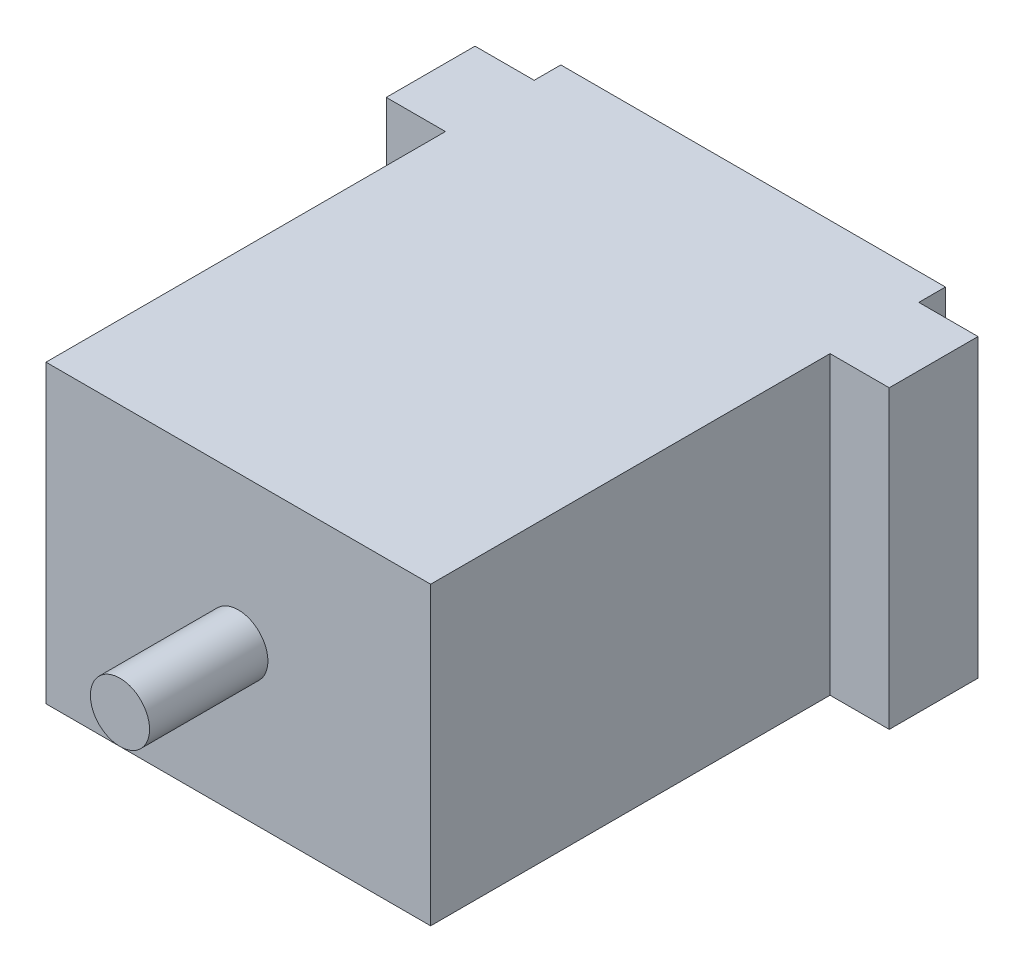
ISO-10303-21;
HEADER;
FILE_DESCRIPTION(('STEP AP214'),'2;1');
FILE_NAME('part.step','',(''),(''),'','','');
FILE_SCHEMA(('AUTOMOTIVE_DESIGN { 1 0 10303 214 1 1 1 1 }'));
ENDSEC;
DATA;
#1=APPLICATION_CONTEXT('core data for automotive mechanical design processes');
#2=APPLICATION_PROTOCOL_DEFINITION('international standard','automotive_design',2000,#1);
#3=PRODUCT_CONTEXT('',#1,'mechanical');
#4=PRODUCT('Part','Part','',(#3));
#5=PRODUCT_RELATED_PRODUCT_CATEGORY('part','',(#4));
#6=PRODUCT_DEFINITION_FORMATION('','',#4);
#7=PRODUCT_DEFINITION_CONTEXT('part definition',#1,'design');
#8=PRODUCT_DEFINITION('design','',#6,#7);
#9=PRODUCT_DEFINITION_SHAPE('','',#8);
#10=(LENGTH_UNIT() NAMED_UNIT(*) SI_UNIT(.MILLI.,.METRE.));
#11=(NAMED_UNIT(*) PLANE_ANGLE_UNIT() SI_UNIT($,.RADIAN.));
#12=(NAMED_UNIT(*) SI_UNIT($,.STERADIAN.) SOLID_ANGLE_UNIT());
#13=UNCERTAINTY_MEASURE_WITH_UNIT(LENGTH_MEASURE(1.E-05),#10,'distance_accuracy_value','');
#14=(GEOMETRIC_REPRESENTATION_CONTEXT(3) GLOBAL_UNCERTAINTY_ASSIGNED_CONTEXT((#13)) GLOBAL_UNIT_ASSIGNED_CONTEXT((#10,
#11,#12)) REPRESENTATION_CONTEXT('',''));
#15=CARTESIAN_POINT('',(0.,0.,0.));
#16=DIRECTION('',(0.,0.,1.));
#17=DIRECTION('',(1.,0.,0.));
#18=AXIS2_PLACEMENT_3D('',#15,#16,#17);
#19=CARTESIAN_POINT('',(-32.5,25.,150.));
#20=DIRECTION('',(1.,0.,0.));
#21=DIRECTION('',(0.,0.,-1.));
#22=AXIS2_PLACEMENT_3D('',#19,#20,#21);
#23=PLANE('',#22);
#24=DIRECTION('',(0.,0.,-1.));
#25=VECTOR('',#24,1.);
#26=CARTESIAN_POINT('',(-32.5,25.,150.));
#27=LINE('',#26,#25);
#28=CARTESIAN_POINT('',(-32.5,25.,67.5));
#29=VERTEX_POINT('',#28);
#30=CARTESIAN_POINT('',(-32.5,25.,63.));
#31=VERTEX_POINT('',#30);
#32=EDGE_CURVE('E145',#29,#31,#27,.T.);
#33=ORIENTED_EDGE('',*,*,#32,.T.);
#34=DIRECTION('',(0.,1.,0.));
#35=VECTOR('',#34,1.);
#36=CARTESIAN_POINT('',(-32.5,-25.,63.));
#37=LINE('',#36,#35);
#38=CARTESIAN_POINT('',(-32.5,-25.,63.));
#39=VERTEX_POINT('',#38);
#40=EDGE_CURVE('E130',#39,#31,#37,.T.);
#41=ORIENTED_EDGE('',*,*,#40,.F.);
#42=DIRECTION('',(0.,0.,-1.));
#43=VECTOR('',#42,1.);
#44=CARTESIAN_POINT('',(-32.5,-25.,150.));
#45=LINE('',#44,#43);
#46=CARTESIAN_POINT('',(-32.5,-25.,67.5));
#47=VERTEX_POINT('',#46);
#48=EDGE_CURVE('E143',#47,#39,#45,.T.);
#49=ORIENTED_EDGE('',*,*,#48,.F.);
#50=DIRECTION('',(0.,1.,0.));
#51=VECTOR('',#50,1.);
#52=CARTESIAN_POINT('',(-32.5,25.,67.5));
#53=LINE('',#52,#51);
#54=EDGE_CURVE('E190',#47,#29,#53,.T.);
#55=ORIENTED_EDGE('',*,*,#54,.T.);
#56=EDGE_LOOP('',(#33,#41,#49,#55));
#57=FACE_BOUND('',#56,.T.);
#58=ADVANCED_FACE('F39',(#57),#23,.F.);
#59=CARTESIAN_POINT('',(32.5,25.,150.));
#60=DIRECTION('',(-1.,0.,0.));
#61=DIRECTION('',(0.,-1.,0.));
#62=AXIS2_PLACEMENT_3D('',#59,#60,#61);
#63=PLANE('',#62);
#64=DIRECTION('',(0.,0.,-1.));
#65=VECTOR('',#64,1.);
#66=CARTESIAN_POINT('',(32.5,-25.,150.));
#67=LINE('',#66,#65);
#68=CARTESIAN_POINT('',(32.5,-25.,67.5));
#69=VERTEX_POINT('',#68);
#70=CARTESIAN_POINT('',(32.5,-25.,63.));
#71=VERTEX_POINT('',#70);
#72=EDGE_CURVE('E159',#69,#71,#67,.T.);
#73=ORIENTED_EDGE('',*,*,#72,.T.);
#74=DIRECTION('',(0.,1.,0.));
#75=VECTOR('',#74,1.);
#76=CARTESIAN_POINT('',(32.5,-25.,63.));
#77=LINE('',#76,#75);
#78=CARTESIAN_POINT('',(32.5,25.,63.));
#79=VERTEX_POINT('',#78);
#80=EDGE_CURVE('E55',#71,#79,#77,.T.);
#81=ORIENTED_EDGE('',*,*,#80,.T.);
#82=DIRECTION('',(0.,0.,-1.));
#83=VECTOR('',#82,1.);
#84=CARTESIAN_POINT('',(32.5,25.,150.));
#85=LINE('',#84,#83);
#86=CARTESIAN_POINT('',(32.5,25.,67.5));
#87=VERTEX_POINT('',#86);
#88=EDGE_CURVE('E48',#87,#79,#85,.T.);
#89=ORIENTED_EDGE('',*,*,#88,.F.);
#90=DIRECTION('',(0.,1.,0.));
#91=VECTOR('',#90,1.);
#92=CARTESIAN_POINT('',(32.5,25.,67.5));
#93=LINE('',#92,#91);
#94=EDGE_CURVE('E178',#69,#87,#93,.T.);
#95=ORIENTED_EDGE('',*,*,#94,.F.);
#96=EDGE_LOOP('',(#73,#81,#89,#95));
#97=FACE_BOUND('',#96,.T.);
#98=ADVANCED_FACE('F41',(#97),#63,.F.);
#99=DIRECTION('',(0.,-1.,0.));
#100=VECTOR('',#99,1.);
#101=CARTESIAN_POINT('',(32.5,25.,82.5));
#102=LINE('',#101,#100);
#103=CARTESIAN_POINT('',(32.5,25.,82.5));
#104=VERTEX_POINT('',#103);
#105=CARTESIAN_POINT('',(32.5,-25.,82.5));
#106=VERTEX_POINT('',#105);
#107=EDGE_CURVE('E226',#104,#106,#102,.T.);
#108=ORIENTED_EDGE('',*,*,#107,.F.);
#109=CARTESIAN_POINT('',(32.5,25.,150.));
#110=VERTEX_POINT('',#109);
#111=EDGE_CURVE('E11',#110,#104,#85,.T.);
#112=ORIENTED_EDGE('',*,*,#111,.F.);
#113=DIRECTION('',(0.,1.,0.));
#114=VECTOR('',#113,1.);
#115=CARTESIAN_POINT('',(32.5,25.,150.));
#116=LINE('',#115,#114);
#117=CARTESIAN_POINT('',(32.5,-25.,150.));
#118=VERTEX_POINT('',#117);
#119=EDGE_CURVE('E254',#118,#110,#116,.T.);
#120=ORIENTED_EDGE('',*,*,#119,.F.);
#121=EDGE_CURVE('E154',#118,#106,#67,.T.);
#122=ORIENTED_EDGE('',*,*,#121,.T.);
#123=EDGE_LOOP('',(#108,#112,#120,#122));
#124=FACE_BOUND('',#123,.T.);
#125=ADVANCED_FACE('F276',(#124),#63,.F.);
#126=CARTESIAN_POINT('',(-32.5,25.,150.));
#127=DIRECTION('',(0.,-1.,0.));
#128=DIRECTION('',(0.,0.,-1.));
#129=AXIS2_PLACEMENT_3D('',#126,#127,#128);
#130=PLANE('',#129);
#131=ORIENTED_EDGE('',*,*,#88,.T.);
#132=DIRECTION('',(1.,0.,0.));
#133=VECTOR('',#132,1.);
#134=CARTESIAN_POINT('',(-32.5,25.,63.));
#135=LINE('',#134,#133);
#136=EDGE_CURVE('E137',#31,#79,#135,.T.);
#137=ORIENTED_EDGE('',*,*,#136,.F.);
#138=ORIENTED_EDGE('',*,*,#32,.F.);
#139=DIRECTION('',(1.,0.,0.));
#140=VECTOR('',#139,1.);
#141=CARTESIAN_POINT('',(-42.5,25.,67.5));
#142=LINE('',#141,#140);
#143=CARTESIAN_POINT('',(-42.5,25.,67.5));
#144=VERTEX_POINT('',#143);
#145=EDGE_CURVE('E207',#144,#29,#142,.T.);
#146=ORIENTED_EDGE('',*,*,#145,.F.);
#147=DIRECTION('',(0.,0.,1.));
#148=VECTOR('',#147,1.);
#149=CARTESIAN_POINT('',(-42.5,25.,82.5));
#150=LINE('',#149,#148);
#151=CARTESIAN_POINT('',(-42.5,25.,82.5));
#152=VERTEX_POINT('',#151);
#153=EDGE_CURVE('E203',#144,#152,#150,.T.);
#154=ORIENTED_EDGE('',*,*,#153,.T.);
#155=DIRECTION('',(1.,0.,0.));
#156=VECTOR('',#155,1.);
#157=CARTESIAN_POINT('',(-42.5,25.,82.5));
#158=LINE('',#157,#156);
#159=CARTESIAN_POINT('',(-32.5,25.,82.5));
#160=VERTEX_POINT('',#159);
#161=EDGE_CURVE('E214',#152,#160,#158,.T.);
#162=ORIENTED_EDGE('',*,*,#161,.T.);
#163=CARTESIAN_POINT('',(-32.5,25.,150.));
#164=VERTEX_POINT('',#163);
#165=EDGE_CURVE('E162',#164,#160,#27,.T.);
#166=ORIENTED_EDGE('',*,*,#165,.F.);
#167=DIRECTION('',(-1.,0.,0.));
#168=VECTOR('',#167,1.);
#169=CARTESIAN_POINT('',(-32.5,25.,150.));
#170=LINE('',#169,#168);
#171=EDGE_CURVE('E258',#110,#164,#170,.T.);
#172=ORIENTED_EDGE('',*,*,#171,.F.);
#173=ORIENTED_EDGE('',*,*,#111,.T.);
#174=DIRECTION('',(-1.,0.,0.));
#175=VECTOR('',#174,1.);
#176=CARTESIAN_POINT('',(42.5,25.,82.5));
#177=LINE('',#176,#175);
#178=CARTESIAN_POINT('',(42.5,25.,82.5));
#179=VERTEX_POINT('',#178);
#180=EDGE_CURVE('E248',#179,#104,#177,.T.);
#181=ORIENTED_EDGE('',*,*,#180,.F.);
#182=DIRECTION('',(0.,0.,1.));
#183=VECTOR('',#182,1.);
#184=CARTESIAN_POINT('',(42.5,25.,82.5));
#185=LINE('',#184,#183);
#186=CARTESIAN_POINT('',(42.5,25.,67.5));
#187=VERTEX_POINT('',#186);
#188=EDGE_CURVE('E225',#187,#179,#185,.T.);
#189=ORIENTED_EDGE('',*,*,#188,.F.);
#190=DIRECTION('',(-1.,0.,0.));
#191=VECTOR('',#190,1.);
#192=CARTESIAN_POINT('',(42.5,25.,67.5));
#193=LINE('',#192,#191);
#194=EDGE_CURVE('E175',#187,#87,#193,.T.);
#195=ORIENTED_EDGE('',*,*,#194,.T.);
#196=EDGE_LOOP('',(#131,#137,#138,#146,#154,#162,#166,#172,#173,#181,#189,#195));
#197=FACE_BOUND('',#196,.T.);
#198=ADVANCED_FACE('F173',(#197),#130,.F.);
#199=ORIENTED_EDGE('',*,*,#165,.T.);
#200=DIRECTION('',(0.,-1.,0.));
#201=VECTOR('',#200,1.);
#202=CARTESIAN_POINT('',(-32.5,25.,82.5));
#203=LINE('',#202,#201);
#204=CARTESIAN_POINT('',(-32.5,-25.,82.5));
#205=VERTEX_POINT('',#204);
#206=EDGE_CURVE('E197',#160,#205,#203,.T.);
#207=ORIENTED_EDGE('',*,*,#206,.T.);
#208=CARTESIAN_POINT('',(-32.5,-25.,150.));
#209=VERTEX_POINT('',#208);
#210=EDGE_CURVE('E153',#209,#205,#45,.T.);
#211=ORIENTED_EDGE('',*,*,#210,.F.);
#212=DIRECTION('',(0.,-1.,0.));
#213=VECTOR('',#212,1.);
#214=CARTESIAN_POINT('',(-32.5,25.,150.));
#215=LINE('',#214,#213);
#216=EDGE_CURVE('E261',#164,#209,#215,.T.);
#217=ORIENTED_EDGE('',*,*,#216,.F.);
#218=EDGE_LOOP('',(#199,#207,#211,#217));
#219=FACE_BOUND('',#218,.T.);
#220=ADVANCED_FACE('F298',(#219),#23,.F.);
#221=CARTESIAN_POINT('',(-32.5,-25.,150.));
#222=DIRECTION('',(0.,1.,0.));
#223=DIRECTION('',(0.,0.,1.));
#224=AXIS2_PLACEMENT_3D('',#221,#222,#223);
#225=PLANE('',#224);
#226=ORIENTED_EDGE('',*,*,#48,.T.);
#227=DIRECTION('',(1.,0.,0.));
#228=VECTOR('',#227,1.);
#229=CARTESIAN_POINT('',(-32.5,-25.,63.));
#230=LINE('',#229,#228);
#231=EDGE_CURVE('E127',#39,#71,#230,.T.);
#232=ORIENTED_EDGE('',*,*,#231,.T.);
#233=ORIENTED_EDGE('',*,*,#72,.F.);
#234=DIRECTION('',(-1.,0.,0.));
#235=VECTOR('',#234,1.);
#236=CARTESIAN_POINT('',(42.5,-25.,67.5));
#237=LINE('',#236,#235);
#238=CARTESIAN_POINT('',(42.5,-25.,67.5));
#239=VERTEX_POINT('',#238);
#240=EDGE_CURVE('E235',#239,#69,#237,.T.);
#241=ORIENTED_EDGE('',*,*,#240,.F.);
#242=DIRECTION('',(0.,0.,-1.));
#243=VECTOR('',#242,1.);
#244=CARTESIAN_POINT('',(42.5,-25.,82.5));
#245=LINE('',#244,#243);
#246=CARTESIAN_POINT('',(42.5,-25.,82.5));
#247=VERTEX_POINT('',#246);
#248=EDGE_CURVE('E232',#247,#239,#245,.T.);
#249=ORIENTED_EDGE('',*,*,#248,.F.);
#250=DIRECTION('',(-1.,0.,0.));
#251=VECTOR('',#250,1.);
#252=CARTESIAN_POINT('',(42.5,-25.,82.5));
#253=LINE('',#252,#251);
#254=EDGE_CURVE('E244',#247,#106,#253,.T.);
#255=ORIENTED_EDGE('',*,*,#254,.T.);
#256=ORIENTED_EDGE('',*,*,#121,.F.);
#257=DIRECTION('',(1.,0.,0.));
#258=VECTOR('',#257,1.);
#259=CARTESIAN_POINT('',(-32.5,-25.,150.));
#260=LINE('',#259,#258);
#261=EDGE_CURVE('E263',#209,#118,#260,.T.);
#262=ORIENTED_EDGE('',*,*,#261,.F.);
#263=ORIENTED_EDGE('',*,*,#210,.T.);
#264=DIRECTION('',(1.,0.,0.));
#265=VECTOR('',#264,1.);
#266=CARTESIAN_POINT('',(-42.5,-25.,82.5));
#267=LINE('',#266,#265);
#268=CARTESIAN_POINT('',(-42.5,-25.,82.5));
#269=VERTEX_POINT('',#268);
#270=EDGE_CURVE('E63',#269,#205,#267,.T.);
#271=ORIENTED_EDGE('',*,*,#270,.F.);
#272=DIRECTION('',(0.,0.,-1.));
#273=VECTOR('',#272,1.);
#274=CARTESIAN_POINT('',(-42.5,-25.,82.5));
#275=LINE('',#274,#273);
#276=CARTESIAN_POINT('',(-42.5,-25.,67.5));
#277=VERTEX_POINT('',#276);
#278=EDGE_CURVE('E196',#269,#277,#275,.T.);
#279=ORIENTED_EDGE('',*,*,#278,.T.);
#280=DIRECTION('',(1.,0.,0.));
#281=VECTOR('',#280,1.);
#282=CARTESIAN_POINT('',(-42.5,-25.,67.5));
#283=LINE('',#282,#281);
#284=EDGE_CURVE('E150',#277,#47,#283,.T.);
#285=ORIENTED_EDGE('',*,*,#284,.T.);
#286=EDGE_LOOP('',(#226,#232,#233,#241,#249,#255,#256,#262,#263,#271,#279,#285));
#287=FACE_BOUND('',#286,.T.);
#288=ADVANCED_FACE('F148',(#287),#225,.F.);
#289=CARTESIAN_POINT('',(0.,0.,150.));
#290=DIRECTION('',(0.,0.,1.));
#291=DIRECTION('',(1.,0.,0.));
#292=AXIS2_PLACEMENT_3D('',#289,#290,#291);
#293=PLANE('',#292);
#294=CARTESIAN_POINT('',(0.,0.,150.));
#295=DIRECTION('',(0.,0.,1.));
#296=DIRECTION('',(1.,0.,0.));
#297=AXIS2_PLACEMENT_3D('',#294,#295,#296);
#298=CIRCLE('',#297,5.);
#299=CARTESIAN_POINT('',(5.,0.,150.));
#300=VERTEX_POINT('',#299);
#301=EDGE_CURVE('E180',#300,#300,#298,.T.);
#302=ORIENTED_EDGE('',*,*,#301,.F.);
#303=EDGE_LOOP('',(#302));
#304=FACE_BOUND('',#303,.T.);
#305=ORIENTED_EDGE('',*,*,#119,.T.);
#306=ORIENTED_EDGE('',*,*,#171,.T.);
#307=ORIENTED_EDGE('',*,*,#216,.T.);
#308=ORIENTED_EDGE('',*,*,#261,.T.);
#309=EDGE_LOOP('',(#305,#306,#307,#308));
#310=FACE_BOUND('',#309,.T.);
#311=ADVANCED_FACE('F269',(#304,#310),#293,.T.);
#312=CARTESIAN_POINT('',(42.5,25.,67.5));
#313=DIRECTION('',(0.,0.,1.));
#314=DIRECTION('',(0.,-1.,0.));
#315=AXIS2_PLACEMENT_3D('',#312,#313,#314);
#316=PLANE('',#315);
#317=ORIENTED_EDGE('',*,*,#94,.T.);
#318=ORIENTED_EDGE('',*,*,#194,.F.);
#319=DIRECTION('',(0.,1.,0.));
#320=VECTOR('',#319,1.);
#321=CARTESIAN_POINT('',(42.5,25.,67.5));
#322=LINE('',#321,#320);
#323=EDGE_CURVE('E221',#239,#187,#322,.T.);
#324=ORIENTED_EDGE('',*,*,#323,.F.);
#325=ORIENTED_EDGE('',*,*,#240,.T.);
#326=EDGE_LOOP('',(#317,#318,#324,#325));
#327=FACE_BOUND('',#326,.T.);
#328=ADVANCED_FACE('F286',(#327),#316,.F.);
#329=CARTESIAN_POINT('',(42.5,25.,82.5));
#330=DIRECTION('',(0.,0.,-1.));
#331=DIRECTION('',(0.,1.,0.));
#332=AXIS2_PLACEMENT_3D('',#329,#330,#331);
#333=PLANE('',#332);
#334=ORIENTED_EDGE('',*,*,#107,.T.);
#335=ORIENTED_EDGE('',*,*,#254,.F.);
#336=DIRECTION('',(0.,-1.,0.));
#337=VECTOR('',#336,1.);
#338=CARTESIAN_POINT('',(42.5,25.,82.5));
#339=LINE('',#338,#337);
#340=EDGE_CURVE('E229',#179,#247,#339,.T.);
#341=ORIENTED_EDGE('',*,*,#340,.F.);
#342=ORIENTED_EDGE('',*,*,#180,.T.);
#343=EDGE_LOOP('',(#334,#335,#341,#342));
#344=FACE_BOUND('',#343,.T.);
#345=ADVANCED_FACE('F280',(#344),#333,.F.);
#346=CARTESIAN_POINT('',(42.5,0.,0.));
#347=DIRECTION('',(1.,0.,0.));
#348=DIRECTION('',(0.,0.,-1.));
#349=AXIS2_PLACEMENT_3D('',#346,#347,#348);
#350=PLANE('',#349);
#351=ORIENTED_EDGE('',*,*,#323,.T.);
#352=ORIENTED_EDGE('',*,*,#188,.T.);
#353=ORIENTED_EDGE('',*,*,#340,.T.);
#354=ORIENTED_EDGE('',*,*,#248,.T.);
#355=EDGE_LOOP('',(#351,#352,#353,#354));
#356=FACE_BOUND('',#355,.T.);
#357=ADVANCED_FACE('F282',(#356),#350,.T.);
#358=CARTESIAN_POINT('',(-42.5,25.,67.5));
#359=DIRECTION('',(0.,0.,-1.));
#360=DIRECTION('',(0.,1.,0.));
#361=AXIS2_PLACEMENT_3D('',#358,#359,#360);
#362=PLANE('',#361);
#363=ORIENTED_EDGE('',*,*,#54,.F.);
#364=ORIENTED_EDGE('',*,*,#284,.F.);
#365=DIRECTION('',(0.,1.,0.));
#366=VECTOR('',#365,1.);
#367=CARTESIAN_POINT('',(-42.5,25.,67.5));
#368=LINE('',#367,#366);
#369=EDGE_CURVE('E192',#277,#144,#368,.T.);
#370=ORIENTED_EDGE('',*,*,#369,.T.);
#371=ORIENTED_EDGE('',*,*,#145,.T.);
#372=EDGE_LOOP('',(#363,#364,#370,#371));
#373=FACE_BOUND('',#372,.T.);
#374=ADVANCED_FACE('F374',(#373),#362,.T.);
#375=CARTESIAN_POINT('',(-42.5,25.,82.5));
#376=DIRECTION('',(0.,0.,1.));
#377=DIRECTION('',(0.,-1.,0.));
#378=AXIS2_PLACEMENT_3D('',#375,#376,#377);
#379=PLANE('',#378);
#380=ORIENTED_EDGE('',*,*,#206,.F.);
#381=ORIENTED_EDGE('',*,*,#161,.F.);
#382=DIRECTION('',(0.,-1.,0.));
#383=VECTOR('',#382,1.);
#384=CARTESIAN_POINT('',(-42.5,25.,82.5));
#385=LINE('',#384,#383);
#386=EDGE_CURVE('E200',#152,#269,#385,.T.);
#387=ORIENTED_EDGE('',*,*,#386,.T.);
#388=ORIENTED_EDGE('',*,*,#270,.T.);
#389=EDGE_LOOP('',(#380,#381,#387,#388));
#390=FACE_BOUND('',#389,.T.);
#391=ADVANCED_FACE('F366',(#390),#379,.T.);
#392=CARTESIAN_POINT('',(-42.5,0.,0.));
#393=DIRECTION('',(-1.,0.,0.));
#394=DIRECTION('',(0.,0.,-1.));
#395=AXIS2_PLACEMENT_3D('',#392,#393,#394);
#396=PLANE('',#395);
#397=ORIENTED_EDGE('',*,*,#369,.F.);
#398=ORIENTED_EDGE('',*,*,#278,.F.);
#399=ORIENTED_EDGE('',*,*,#386,.F.);
#400=ORIENTED_EDGE('',*,*,#153,.F.);
#401=EDGE_LOOP('',(#397,#398,#399,#400));
#402=FACE_BOUND('',#401,.T.);
#403=ADVANCED_FACE('F357',(#402),#396,.T.);
#404=CARTESIAN_POINT('',(0.,0.,170.));
#405=DIRECTION('',(0.,0.,-1.));
#406=DIRECTION('',(-1.,0.,0.));
#407=AXIS2_PLACEMENT_3D('',#404,#405,#406);
#408=CYLINDRICAL_SURFACE('',#407,5.);
#409=CARTESIAN_POINT('',(0.,0.,170.));
#410=DIRECTION('',(0.,0.,1.));
#411=DIRECTION('',(1.,0.,0.));
#412=AXIS2_PLACEMENT_3D('',#409,#410,#411);
#413=CIRCLE('',#412,5.);
#414=CARTESIAN_POINT('',(5.,0.,170.));
#415=VERTEX_POINT('',#414);
#416=EDGE_CURVE('E184',#415,#415,#413,.T.);
#417=ORIENTED_EDGE('',*,*,#416,.F.);
#418=EDGE_LOOP('',(#417));
#419=FACE_BOUND('',#418,.T.);
#420=ORIENTED_EDGE('',*,*,#301,.T.);
#421=EDGE_LOOP('',(#420));
#422=FACE_BOUND('',#421,.T.);
#423=ADVANCED_FACE('F350',(#419,#422),#408,.T.);
#424=CARTESIAN_POINT('',(0.,0.,170.));
#425=DIRECTION('',(0.,0.,1.));
#426=DIRECTION('',(1.,0.,0.));
#427=AXIS2_PLACEMENT_3D('',#424,#425,#426);
#428=PLANE('',#427);
#429=ORIENTED_EDGE('',*,*,#416,.T.);
#430=EDGE_LOOP('',(#429));
#431=FACE_BOUND('',#430,.T.);
#432=ADVANCED_FACE('F341',(#431),#428,.T.);
#433=CARTESIAN_POINT('',(-32.5,-25.,63.));
#434=DIRECTION('',(0.,0.,1.));
#435=DIRECTION('',(1.,0.,0.));
#436=AXIS2_PLACEMENT_3D('',#433,#434,#435);
#437=PLANE('',#436);
#438=ORIENTED_EDGE('',*,*,#136,.T.);
#439=ORIENTED_EDGE('',*,*,#80,.F.);
#440=ORIENTED_EDGE('',*,*,#231,.F.);
#441=ORIENTED_EDGE('',*,*,#40,.T.);
#442=EDGE_LOOP('',(#438,#439,#440,#441));
#443=FACE_BOUND('',#442,.T.);
#444=ADVANCED_FACE('F129',(#443),#437,.F.);
#445=CLOSED_SHELL('',(#58,#98,#125,#198,#220,#288,#311,#328,#345,#357,#374,#391,#403,#423,#432,#444));
#446=MANIFOLD_SOLID_BREP('B2',#445);
#447=ADVANCED_BREP_SHAPE_REPRESENTATION('',(#18,#446),#14);
#448=SHAPE_DEFINITION_REPRESENTATION(#9,#447);
ENDSEC;
END-ISO-10303-21;
